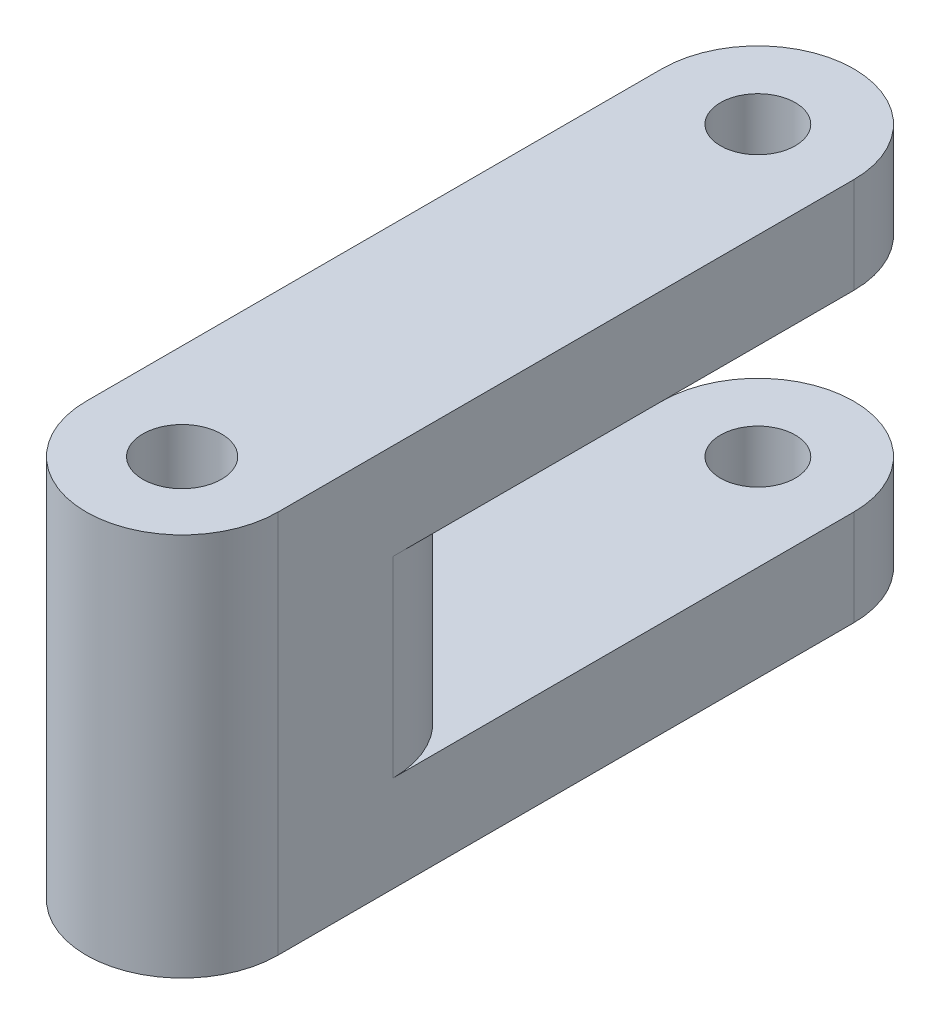
ISO-10303-21;
HEADER;
FILE_DESCRIPTION(('STEP AP214'),'2;1');
FILE_NAME('part.step','',(''),(''),'','','');
FILE_SCHEMA(('AUTOMOTIVE_DESIGN { 1 0 10303 214 1 1 1 1 }'));
ENDSEC;
DATA;
#1=APPLICATION_CONTEXT('core data for automotive mechanical design processes');
#2=APPLICATION_PROTOCOL_DEFINITION('international standard','automotive_design',2000,#1);
#3=PRODUCT_CONTEXT('',#1,'mechanical');
#4=PRODUCT('Part','Part','',(#3));
#5=PRODUCT_RELATED_PRODUCT_CATEGORY('part','',(#4));
#6=PRODUCT_DEFINITION_FORMATION('','',#4);
#7=PRODUCT_DEFINITION_CONTEXT('part definition',#1,'design');
#8=PRODUCT_DEFINITION('design','',#6,#7);
#9=PRODUCT_DEFINITION_SHAPE('','',#8);
#10=(LENGTH_UNIT() NAMED_UNIT(*) SI_UNIT(.MILLI.,.METRE.));
#11=(NAMED_UNIT(*) PLANE_ANGLE_UNIT() SI_UNIT($,.RADIAN.));
#12=(NAMED_UNIT(*) SI_UNIT($,.STERADIAN.) SOLID_ANGLE_UNIT());
#13=UNCERTAINTY_MEASURE_WITH_UNIT(LENGTH_MEASURE(1.E-05),#10,'distance_accuracy_value','');
#14=(GEOMETRIC_REPRESENTATION_CONTEXT(3) GLOBAL_UNCERTAINTY_ASSIGNED_CONTEXT((#13)) GLOBAL_UNIT_ASSIGNED_CONTEXT((#10,
#11,#12)) REPRESENTATION_CONTEXT('',''));
#15=CARTESIAN_POINT('',(0.,0.,0.));
#16=DIRECTION('',(0.,0.,1.));
#17=DIRECTION('',(1.,0.,0.));
#18=AXIS2_PLACEMENT_3D('',#15,#16,#17);
#19=CARTESIAN_POINT('',(0.,5.,0.));
#20=DIRECTION('',(0.,1.,0.));
#21=DIRECTION('',(0.,0.,1.));
#22=AXIS2_PLACEMENT_3D('',#19,#20,#21);
#23=PLANE('',#22);
#24=CARTESIAN_POINT('',(0.,5.,-6.));
#25=DIRECTION('',(0.,1.,0.));
#26=DIRECTION('',(0.,0.,1.));
#27=AXIS2_PLACEMENT_3D('',#24,#25,#26);
#28=CIRCLE('',#27,5.);
#29=CARTESIAN_POINT('',(5.,5.,-6.));
#30=VERTEX_POINT('',#29);
#31=CARTESIAN_POINT('',(-5.,5.,-6.));
#32=VERTEX_POINT('',#31);
#33=EDGE_CURVE('E85',#30,#32,#28,.T.);
#34=ORIENTED_EDGE('',*,*,#33,.F.);
#35=DIRECTION('',(0.,0.,-1.));
#36=VECTOR('',#35,1.);
#37=CARTESIAN_POINT('',(5.,5.,0.));
#38=LINE('',#37,#36);
#39=CARTESIAN_POINT('',(5.,5.,-30.));
#40=VERTEX_POINT('',#39);
#41=EDGE_CURVE('E124',#30,#40,#38,.T.);
#42=ORIENTED_EDGE('',*,*,#41,.T.);
#43=CARTESIAN_POINT('',(0.,5.,-30.));
#44=DIRECTION('',(0.,1.,0.));
#45=DIRECTION('',(0.,0.,1.));
#46=AXIS2_PLACEMENT_3D('',#43,#44,#45);
#47=CIRCLE('',#46,5.);
#48=CARTESIAN_POINT('',(-5.,5.,-30.));
#49=VERTEX_POINT('',#48);
#50=EDGE_CURVE('E91',#40,#49,#47,.T.);
#51=ORIENTED_EDGE('',*,*,#50,.T.);
#52=DIRECTION('',(0.,0.,1.));
#53=VECTOR('',#52,1.);
#54=CARTESIAN_POINT('',(-5.,5.,0.));
#55=LINE('',#54,#53);
#56=EDGE_CURVE('E135',#49,#32,#55,.T.);
#57=ORIENTED_EDGE('',*,*,#56,.T.);
#58=EDGE_LOOP('',(#34,#42,#51,#57));
#59=FACE_BOUND('',#58,.T.);
#60=CARTESIAN_POINT('',(0.,5.,-30.));
#61=DIRECTION('',(0.,1.,0.));
#62=DIRECTION('',(0.,0.,1.));
#63=AXIS2_PLACEMENT_3D('',#60,#61,#62);
#64=CIRCLE('',#63,1.95);
#65=CARTESIAN_POINT('',(0.,5.,-28.05));
#66=VERTEX_POINT('',#65);
#67=EDGE_CURVE('E141',#66,#66,#64,.T.);
#68=ORIENTED_EDGE('',*,*,#67,.F.);
#69=EDGE_LOOP('',(#68));
#70=FACE_BOUND('',#69,.T.);
#71=ADVANCED_FACE('F69',(#59,#70),#23,.T.);
#72=CARTESIAN_POINT('',(0.,0.,0.));
#73=DIRECTION('',(0.,1.,0.));
#74=DIRECTION('',(0.,0.,1.));
#75=AXIS2_PLACEMENT_3D('',#72,#73,#74);
#76=PLANE('',#75);
#77=CARTESIAN_POINT('',(0.,0.,0.));
#78=DIRECTION('',(0.,1.,0.));
#79=DIRECTION('',(0.,0.,1.));
#80=AXIS2_PLACEMENT_3D('',#77,#78,#79);
#81=CIRCLE('',#80,5.);
#82=CARTESIAN_POINT('',(-5.,0.,0.));
#83=VERTEX_POINT('',#82);
#84=CARTESIAN_POINT('',(5.,0.,0.));
#85=VERTEX_POINT('',#84);
#86=EDGE_CURVE('E130',#83,#85,#81,.T.);
#87=ORIENTED_EDGE('',*,*,#86,.F.);
#88=DIRECTION('',(0.,0.,1.));
#89=VECTOR('',#88,1.);
#90=CARTESIAN_POINT('',(-5.,0.,0.));
#91=LINE('',#90,#89);
#92=CARTESIAN_POINT('',(-5.,0.,-30.));
#93=VERTEX_POINT('',#92);
#94=EDGE_CURVE('E111',#93,#83,#91,.T.);
#95=ORIENTED_EDGE('',*,*,#94,.F.);
#96=CARTESIAN_POINT('',(0.,0.,-30.));
#97=DIRECTION('',(0.,1.,0.));
#98=DIRECTION('',(0.,0.,1.));
#99=AXIS2_PLACEMENT_3D('',#96,#97,#98);
#100=CIRCLE('',#99,5.);
#101=CARTESIAN_POINT('',(5.,0.,-30.));
#102=VERTEX_POINT('',#101);
#103=EDGE_CURVE('E125',#102,#93,#100,.T.);
#104=ORIENTED_EDGE('',*,*,#103,.F.);
#105=DIRECTION('',(0.,0.,-1.));
#106=VECTOR('',#105,1.);
#107=CARTESIAN_POINT('',(5.,0.,0.));
#108=LINE('',#107,#106);
#109=EDGE_CURVE('E139',#85,#102,#108,.T.);
#110=ORIENTED_EDGE('',*,*,#109,.F.);
#111=EDGE_LOOP('',(#87,#95,#104,#110));
#112=FACE_BOUND('',#111,.T.);
#113=CARTESIAN_POINT('',(0.,0.,-30.));
#114=DIRECTION('',(0.,1.,0.));
#115=DIRECTION('',(0.,0.,1.));
#116=AXIS2_PLACEMENT_3D('',#113,#114,#115);
#117=CIRCLE('',#116,1.95);
#118=CARTESIAN_POINT('',(0.,0.,-28.05));
#119=VERTEX_POINT('',#118);
#120=EDGE_CURVE('E147',#119,#119,#117,.T.);
#121=ORIENTED_EDGE('',*,*,#120,.T.);
#122=EDGE_LOOP('',(#121));
#123=FACE_BOUND('',#122,.T.);
#124=CARTESIAN_POINT('',(0.,0.,0.));
#125=DIRECTION('',(0.,1.,0.));
#126=DIRECTION('',(0.,0.,1.));
#127=AXIS2_PLACEMENT_3D('',#124,#125,#126);
#128=CIRCLE('',#127,2.05);
#129=CARTESIAN_POINT('',(0.,0.,2.05));
#130=VERTEX_POINT('',#129);
#131=EDGE_CURVE('E219',#130,#130,#128,.T.);
#132=ORIENTED_EDGE('',*,*,#131,.T.);
#133=EDGE_LOOP('',(#132));
#134=FACE_BOUND('',#133,.T.);
#135=ADVANCED_FACE('F137',(#112,#123,#134),#76,.F.);
#136=CARTESIAN_POINT('',(0.,5.,0.));
#137=DIRECTION('',(0.,-1.,0.));
#138=DIRECTION('',(0.,0.,-1.));
#139=AXIS2_PLACEMENT_3D('',#136,#137,#138);
#140=CYLINDRICAL_SURFACE('',#139,5.);
#141=ORIENTED_EDGE('',*,*,#86,.T.);
#142=DIRECTION('',(0.,-1.,0.));
#143=VECTOR('',#142,1.);
#144=CARTESIAN_POINT('',(5.,5.,0.));
#145=LINE('',#144,#143);
#146=CARTESIAN_POINT('',(5.,20.,0.));
#147=VERTEX_POINT('',#146);
#148=EDGE_CURVE('E12',#147,#85,#145,.T.);
#149=ORIENTED_EDGE('',*,*,#148,.F.);
#150=CARTESIAN_POINT('',(0.,20.,0.));
#151=DIRECTION('',(0.,1.,0.));
#152=DIRECTION('',(0.,0.,1.));
#153=AXIS2_PLACEMENT_3D('',#150,#151,#152);
#154=CIRCLE('',#153,5.);
#155=CARTESIAN_POINT('',(-5.,20.,0.));
#156=VERTEX_POINT('',#155);
#157=EDGE_CURVE('E132',#156,#147,#154,.T.);
#158=ORIENTED_EDGE('',*,*,#157,.F.);
#159=DIRECTION('',(0.,-1.,0.));
#160=VECTOR('',#159,1.);
#161=CARTESIAN_POINT('',(-5.,5.,0.));
#162=LINE('',#161,#160);
#163=EDGE_CURVE('E116',#156,#83,#162,.T.);
#164=ORIENTED_EDGE('',*,*,#163,.T.);
#165=EDGE_LOOP('',(#141,#149,#158,#164));
#166=FACE_BOUND('',#165,.T.);
#167=ADVANCED_FACE('F71',(#166),#140,.T.);
#168=CARTESIAN_POINT('',(5.,5.,0.));
#169=DIRECTION('',(-1.,0.,0.));
#170=DIRECTION('',(0.,0.,1.));
#171=AXIS2_PLACEMENT_3D('',#168,#169,#170);
#172=PLANE('',#171);
#173=ORIENTED_EDGE('',*,*,#109,.T.);
#174=DIRECTION('',(0.,-1.,0.));
#175=VECTOR('',#174,1.);
#176=CARTESIAN_POINT('',(5.,5.,-30.));
#177=LINE('',#176,#175);
#178=EDGE_CURVE('E78',#40,#102,#177,.T.);
#179=ORIENTED_EDGE('',*,*,#178,.F.);
#180=ORIENTED_EDGE('',*,*,#41,.F.);
#181=DIRECTION('',(0.,-1.,0.));
#182=VECTOR('',#181,1.);
#183=CARTESIAN_POINT('',(5.,15.,-6.));
#184=LINE('',#183,#182);
#185=CARTESIAN_POINT('',(5.,15.,-6.));
#186=VERTEX_POINT('',#185);
#187=EDGE_CURVE('E216',#186,#30,#184,.T.);
#188=ORIENTED_EDGE('',*,*,#187,.F.);
#189=DIRECTION('',(0.,0.,1.));
#190=VECTOR('',#189,1.);
#191=CARTESIAN_POINT('',(5.,15.,0.));
#192=LINE('',#191,#190);
#193=CARTESIAN_POINT('',(5.,15.,-30.));
#194=VERTEX_POINT('',#193);
#195=EDGE_CURVE('E195',#194,#186,#192,.T.);
#196=ORIENTED_EDGE('',*,*,#195,.F.);
#197=DIRECTION('',(0.,-1.,0.));
#198=VECTOR('',#197,1.);
#199=CARTESIAN_POINT('',(5.,20.,-30.));
#200=LINE('',#199,#198);
#201=CARTESIAN_POINT('',(5.,20.,-30.));
#202=VERTEX_POINT('',#201);
#203=EDGE_CURVE('E180',#202,#194,#200,.T.);
#204=ORIENTED_EDGE('',*,*,#203,.F.);
#205=DIRECTION('',(0.,0.,1.));
#206=VECTOR('',#205,1.);
#207=CARTESIAN_POINT('',(5.,20.,0.));
#208=LINE('',#207,#206);
#209=EDGE_CURVE('E168',#202,#147,#208,.T.);
#210=ORIENTED_EDGE('',*,*,#209,.T.);
#211=ORIENTED_EDGE('',*,*,#148,.T.);
#212=EDGE_LOOP('',(#173,#179,#180,#188,#196,#204,#210,#211));
#213=FACE_BOUND('',#212,.T.);
#214=ADVANCED_FACE('F161',(#213),#172,.F.);
#215=CARTESIAN_POINT('',(0.,5.,-30.));
#216=DIRECTION('',(0.,-1.,0.));
#217=DIRECTION('',(0.,0.,-1.));
#218=AXIS2_PLACEMENT_3D('',#215,#216,#217);
#219=CYLINDRICAL_SURFACE('',#218,5.);
#220=ORIENTED_EDGE('',*,*,#103,.T.);
#221=DIRECTION('',(0.,-1.,0.));
#222=VECTOR('',#221,1.);
#223=CARTESIAN_POINT('',(-5.,5.,-30.));
#224=LINE('',#223,#222);
#225=EDGE_CURVE('E119',#49,#93,#224,.T.);
#226=ORIENTED_EDGE('',*,*,#225,.F.);
#227=ORIENTED_EDGE('',*,*,#50,.F.);
#228=ORIENTED_EDGE('',*,*,#178,.T.);
#229=EDGE_LOOP('',(#220,#226,#227,#228));
#230=FACE_BOUND('',#229,.T.);
#231=ADVANCED_FACE('F159',(#230),#219,.T.);
#232=CARTESIAN_POINT('',(-5.,5.,0.));
#233=DIRECTION('',(1.,0.,0.));
#234=DIRECTION('',(0.,0.,-1.));
#235=AXIS2_PLACEMENT_3D('',#232,#233,#234);
#236=PLANE('',#235);
#237=ORIENTED_EDGE('',*,*,#94,.T.);
#238=ORIENTED_EDGE('',*,*,#163,.F.);
#239=DIRECTION('',(0.,0.,-1.));
#240=VECTOR('',#239,1.);
#241=CARTESIAN_POINT('',(-5.,20.,0.));
#242=LINE('',#241,#240);
#243=CARTESIAN_POINT('',(-5.,20.,-30.));
#244=VERTEX_POINT('',#243);
#245=EDGE_CURVE('E175',#156,#244,#242,.T.);
#246=ORIENTED_EDGE('',*,*,#245,.T.);
#247=DIRECTION('',(0.,-1.,0.));
#248=VECTOR('',#247,1.);
#249=CARTESIAN_POINT('',(-5.,20.,-30.));
#250=LINE('',#249,#248);
#251=CARTESIAN_POINT('',(-5.,15.,-30.));
#252=VERTEX_POINT('',#251);
#253=EDGE_CURVE('E202',#244,#252,#250,.T.);
#254=ORIENTED_EDGE('',*,*,#253,.T.);
#255=DIRECTION('',(0.,0.,-1.));
#256=VECTOR('',#255,1.);
#257=CARTESIAN_POINT('',(-5.,15.,0.));
#258=LINE('',#257,#256);
#259=CARTESIAN_POINT('',(-5.,15.,-6.));
#260=VERTEX_POINT('',#259);
#261=EDGE_CURVE('E190',#260,#252,#258,.T.);
#262=ORIENTED_EDGE('',*,*,#261,.F.);
#263=DIRECTION('',(0.,-1.,0.));
#264=VECTOR('',#263,1.);
#265=CARTESIAN_POINT('',(-5.,15.,-6.));
#266=LINE('',#265,#264);
#267=EDGE_CURVE('E210',#260,#32,#266,.T.);
#268=ORIENTED_EDGE('',*,*,#267,.T.);
#269=ORIENTED_EDGE('',*,*,#56,.F.);
#270=ORIENTED_EDGE('',*,*,#225,.T.);
#271=EDGE_LOOP('',(#237,#238,#246,#254,#262,#268,#269,#270));
#272=FACE_BOUND('',#271,.T.);
#273=ADVANCED_FACE('F113',(#272),#236,.F.);
#274=CARTESIAN_POINT('',(0.,5.,-30.));
#275=DIRECTION('',(0.,-1.,0.));
#276=DIRECTION('',(0.,0.,-1.));
#277=AXIS2_PLACEMENT_3D('',#274,#275,#276);
#278=CYLINDRICAL_SURFACE('',#277,1.95);
#279=ORIENTED_EDGE('',*,*,#67,.T.);
#280=EDGE_LOOP('',(#279));
#281=FACE_BOUND('',#280,.T.);
#282=ORIENTED_EDGE('',*,*,#120,.F.);
#283=EDGE_LOOP('',(#282));
#284=FACE_BOUND('',#283,.T.);
#285=ADVANCED_FACE('F289',(#281,#284),#278,.F.);
#286=CARTESIAN_POINT('',(0.,5.,0.));
#287=DIRECTION('',(0.,-1.,0.));
#288=DIRECTION('',(0.,0.,-1.));
#289=AXIS2_PLACEMENT_3D('',#286,#287,#288);
#290=CYLINDRICAL_SURFACE('',#289,2.05);
#291=ORIENTED_EDGE('',*,*,#131,.F.);
#292=EDGE_LOOP('',(#291));
#293=FACE_BOUND('',#292,.T.);
#294=CARTESIAN_POINT('',(0.,20.,0.));
#295=DIRECTION('',(0.,1.,0.));
#296=DIRECTION('',(0.,0.,1.));
#297=AXIS2_PLACEMENT_3D('',#294,#295,#296);
#298=CIRCLE('',#297,2.05);
#299=CARTESIAN_POINT('',(0.,20.,2.05));
#300=VERTEX_POINT('',#299);
#301=EDGE_CURVE('E191',#300,#300,#298,.T.);
#302=ORIENTED_EDGE('',*,*,#301,.T.);
#303=EDGE_LOOP('',(#302));
#304=FACE_BOUND('',#303,.T.);
#305=ADVANCED_FACE('F278',(#293,#304),#290,.F.);
#306=CARTESIAN_POINT('',(0.,15.,-6.));
#307=DIRECTION('',(0.,-1.,0.));
#308=DIRECTION('',(0.,0.,-1.));
#309=AXIS2_PLACEMENT_3D('',#306,#307,#308);
#310=CYLINDRICAL_SURFACE('',#309,5.);
#311=ORIENTED_EDGE('',*,*,#33,.T.);
#312=ORIENTED_EDGE('',*,*,#267,.F.);
#313=CARTESIAN_POINT('',(0.,15.,-6.));
#314=DIRECTION('',(0.,1.,0.));
#315=DIRECTION('',(0.,0.,1.));
#316=AXIS2_PLACEMENT_3D('',#313,#314,#315);
#317=CIRCLE('',#316,5.);
#318=EDGE_CURVE('E206',#186,#260,#317,.T.);
#319=ORIENTED_EDGE('',*,*,#318,.F.);
#320=ORIENTED_EDGE('',*,*,#187,.T.);
#321=EDGE_LOOP('',(#311,#312,#319,#320));
#322=FACE_BOUND('',#321,.T.);
#323=ADVANCED_FACE('F234',(#322),#310,.T.);
#324=CARTESIAN_POINT('',(0.,20.,-30.));
#325=DIRECTION('',(0.,1.,0.));
#326=DIRECTION('',(0.,0.,1.));
#327=AXIS2_PLACEMENT_3D('',#324,#325,#326);
#328=PLANE('',#327);
#329=ORIENTED_EDGE('',*,*,#301,.F.);
#330=EDGE_LOOP('',(#329));
#331=FACE_BOUND('',#330,.T.);
#332=CARTESIAN_POINT('',(0.,20.,-30.));
#333=DIRECTION('',(0.,1.,0.));
#334=DIRECTION('',(0.,0.,1.));
#335=AXIS2_PLACEMENT_3D('',#332,#333,#334);
#336=CIRCLE('',#335,5.);
#337=EDGE_CURVE('E182',#202,#244,#336,.T.);
#338=ORIENTED_EDGE('',*,*,#337,.T.);
#339=ORIENTED_EDGE('',*,*,#245,.F.);
#340=ORIENTED_EDGE('',*,*,#157,.T.);
#341=ORIENTED_EDGE('',*,*,#209,.F.);
#342=EDGE_LOOP('',(#338,#339,#340,#341));
#343=FACE_BOUND('',#342,.T.);
#344=CARTESIAN_POINT('',(0.,20.,-30.));
#345=DIRECTION('',(0.,1.,0.));
#346=DIRECTION('',(0.,0.,1.));
#347=AXIS2_PLACEMENT_3D('',#344,#345,#346);
#348=CIRCLE('',#347,1.95);
#349=CARTESIAN_POINT('',(0.,20.,-28.05));
#350=VERTEX_POINT('',#349);
#351=EDGE_CURVE('E259',#350,#350,#348,.T.);
#352=ORIENTED_EDGE('',*,*,#351,.F.);
#353=EDGE_LOOP('',(#352));
#354=FACE_BOUND('',#353,.T.);
#355=ADVANCED_FACE('F173',(#331,#343,#354),#328,.T.);
#356=CARTESIAN_POINT('',(0.,15.,-30.));
#357=DIRECTION('',(0.,1.,0.));
#358=DIRECTION('',(0.,0.,1.));
#359=AXIS2_PLACEMENT_3D('',#356,#357,#358);
#360=PLANE('',#359);
#361=ORIENTED_EDGE('',*,*,#195,.T.);
#362=ORIENTED_EDGE('',*,*,#318,.T.);
#363=ORIENTED_EDGE('',*,*,#261,.T.);
#364=CARTESIAN_POINT('',(0.,15.,-30.));
#365=DIRECTION('',(0.,1.,0.));
#366=DIRECTION('',(0.,0.,1.));
#367=AXIS2_PLACEMENT_3D('',#364,#365,#366);
#368=CIRCLE('',#367,5.);
#369=EDGE_CURVE('E186',#194,#252,#368,.T.);
#370=ORIENTED_EDGE('',*,*,#369,.F.);
#371=EDGE_LOOP('',(#361,#362,#363,#370));
#372=FACE_BOUND('',#371,.T.);
#373=CARTESIAN_POINT('',(0.,15.,-30.));
#374=DIRECTION('',(0.,1.,0.));
#375=DIRECTION('',(0.,0.,1.));
#376=AXIS2_PLACEMENT_3D('',#373,#374,#375);
#377=CIRCLE('',#376,1.95);
#378=CARTESIAN_POINT('',(0.,15.,-28.05));
#379=VERTEX_POINT('',#378);
#380=EDGE_CURVE('E260',#379,#379,#377,.T.);
#381=ORIENTED_EDGE('',*,*,#380,.T.);
#382=EDGE_LOOP('',(#381));
#383=FACE_BOUND('',#382,.T.);
#384=ADVANCED_FACE('F242',(#372,#383),#360,.F.);
#385=CARTESIAN_POINT('',(0.,20.,-30.));
#386=DIRECTION('',(0.,-1.,0.));
#387=DIRECTION('',(0.,0.,-1.));
#388=AXIS2_PLACEMENT_3D('',#385,#386,#387);
#389=CYLINDRICAL_SURFACE('',#388,5.);
#390=ORIENTED_EDGE('',*,*,#369,.T.);
#391=ORIENTED_EDGE('',*,*,#253,.F.);
#392=ORIENTED_EDGE('',*,*,#337,.F.);
#393=ORIENTED_EDGE('',*,*,#203,.T.);
#394=EDGE_LOOP('',(#390,#391,#392,#393));
#395=FACE_BOUND('',#394,.T.);
#396=ADVANCED_FACE('F253',(#395),#389,.T.);
#397=CARTESIAN_POINT('',(0.,20.,-30.));
#398=DIRECTION('',(0.,-1.,0.));
#399=DIRECTION('',(0.,0.,-1.));
#400=AXIS2_PLACEMENT_3D('',#397,#398,#399);
#401=CYLINDRICAL_SURFACE('',#400,1.95);
#402=ORIENTED_EDGE('',*,*,#351,.T.);
#403=EDGE_LOOP('',(#402));
#404=FACE_BOUND('',#403,.T.);
#405=ORIENTED_EDGE('',*,*,#380,.F.);
#406=EDGE_LOOP('',(#405));
#407=FACE_BOUND('',#406,.T.);
#408=ADVANCED_FACE('F268',(#404,#407),#401,.F.);
#409=CLOSED_SHELL('',(#71,#135,#167,#214,#231,#273,#285,#305,#323,#355,#384,#396,#408));
#410=MANIFOLD_SOLID_BREP('B2',#409);
#411=ADVANCED_BREP_SHAPE_REPRESENTATION('',(#18,#410),#14);
#412=SHAPE_DEFINITION_REPRESENTATION(#9,#411);
ENDSEC;
END-ISO-10303-21;
